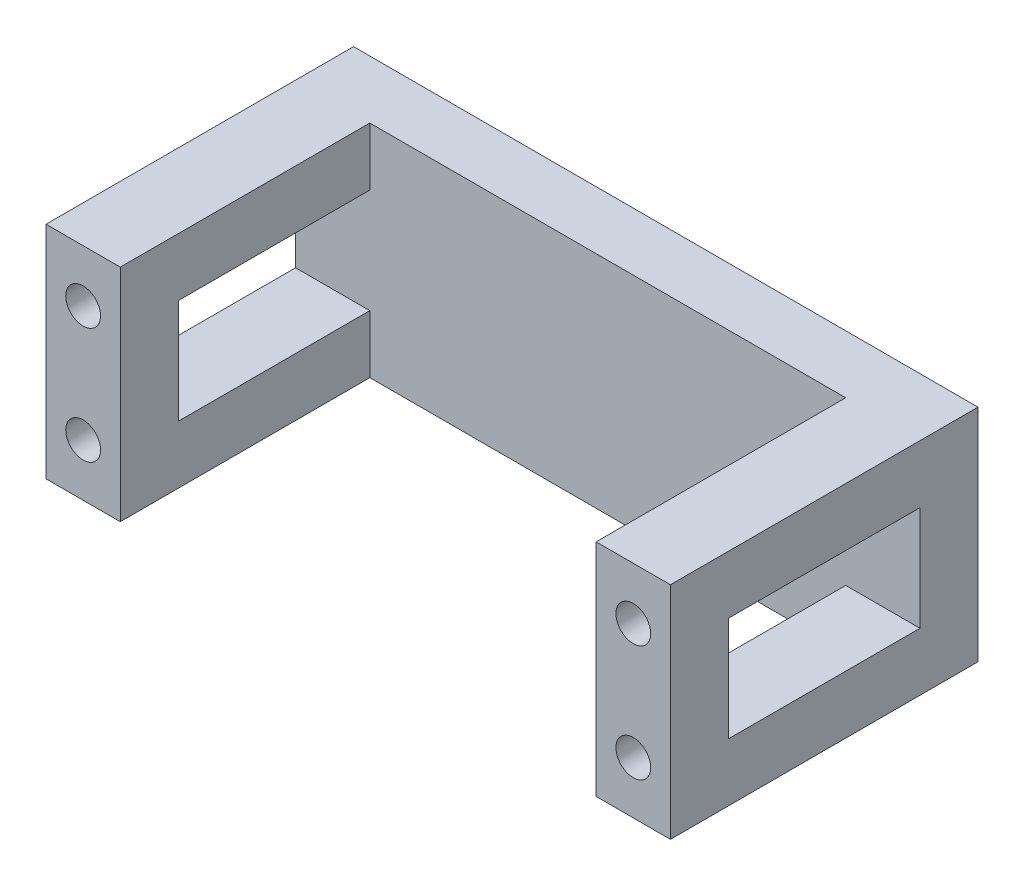
ISO-10303-21;
HEADER;
FILE_DESCRIPTION(('STEP AP214'),'2;1');
FILE_NAME('part.step','',(''),(''),'','','');
FILE_SCHEMA(('AUTOMOTIVE_DESIGN { 1 0 10303 214 1 1 1 1 }'));
ENDSEC;
DATA;
#1=APPLICATION_CONTEXT('core data for automotive mechanical design processes');
#2=APPLICATION_PROTOCOL_DEFINITION('international standard','automotive_design',2000,#1);
#3=PRODUCT_CONTEXT('',#1,'mechanical');
#4=PRODUCT('Part','Part','',(#3));
#5=PRODUCT_RELATED_PRODUCT_CATEGORY('part','',(#4));
#6=PRODUCT_DEFINITION_FORMATION('','',#4);
#7=PRODUCT_DEFINITION_CONTEXT('part definition',#1,'design');
#8=PRODUCT_DEFINITION('design','',#6,#7);
#9=PRODUCT_DEFINITION_SHAPE('','',#8);
#10=(LENGTH_UNIT() NAMED_UNIT(*) SI_UNIT(.MILLI.,.METRE.));
#11=(NAMED_UNIT(*) PLANE_ANGLE_UNIT() SI_UNIT($,.RADIAN.));
#12=(NAMED_UNIT(*) SI_UNIT($,.STERADIAN.) SOLID_ANGLE_UNIT());
#13=UNCERTAINTY_MEASURE_WITH_UNIT(LENGTH_MEASURE(1.E-05),#10,'distance_accuracy_value','');
#14=(GEOMETRIC_REPRESENTATION_CONTEXT(3) GLOBAL_UNCERTAINTY_ASSIGNED_CONTEXT((#13)) GLOBAL_UNIT_ASSIGNED_CONTEXT((#10,
#11,#12)) REPRESENTATION_CONTEXT('',''));
#15=CARTESIAN_POINT('',(0.,0.,0.));
#16=DIRECTION('',(0.,0.,1.));
#17=DIRECTION('',(1.,0.,0.));
#18=AXIS2_PLACEMENT_3D('',#15,#16,#17);
#19=CARTESIAN_POINT('',(3.2,-9.5,-4.));
#20=DIRECTION('',(0.,0.,1.));
#21=DIRECTION('',(1.,0.,0.));
#22=AXIS2_PLACEMENT_3D('',#19,#20,#21);
#23=PLANE('',#22);
#24=CARTESIAN_POINT('',(3.2,-4.5,-4.));
#25=DIRECTION('',(0.,0.,-1.));
#26=DIRECTION('',(-1.,0.,0.));
#27=AXIS2_PLACEMENT_3D('',#24,#25,#26);
#28=CIRCLE('',#27,1.5);
#29=CARTESIAN_POINT('',(1.7,-4.5,-4.));
#30=VERTEX_POINT('',#29);
#31=EDGE_CURVE('E19',#30,#30,#28,.F.);
#32=ORIENTED_EDGE('',*,*,#31,.T.);
#33=EDGE_LOOP('',(#32));
#34=FACE_BOUND('',#33,.T.);
#35=ADVANCED_FACE('F16',(#34),#23,.T.);
#36=CARTESIAN_POINT('',(3.2,-9.5,-4.));
#37=DIRECTION('',(0.,0.,1.));
#38=DIRECTION('',(1.,0.,0.));
#39=AXIS2_PLACEMENT_3D('',#36,#37,#38);
#40=PLANE('',#39);
#41=CARTESIAN_POINT('',(3.2,-14.5,-4.));
#42=DIRECTION('',(0.,0.,-1.));
#43=DIRECTION('',(-1.,0.,0.));
#44=AXIS2_PLACEMENT_3D('',#41,#42,#43);
#45=CIRCLE('',#44,1.5);
#46=CARTESIAN_POINT('',(1.7,-14.5,-4.));
#47=VERTEX_POINT('',#46);
#48=EDGE_CURVE('E182',#47,#47,#45,.F.);
#49=ORIENTED_EDGE('',*,*,#48,.T.);
#50=EDGE_LOOP('',(#49));
#51=FACE_BOUND('',#50,.T.);
#52=ADVANCED_FACE('F280',(#51),#40,.T.);
#53=CARTESIAN_POINT('',(50.6,-9.5,-4.));
#54=DIRECTION('',(0.,0.,1.));
#55=DIRECTION('',(1.,0.,0.));
#56=AXIS2_PLACEMENT_3D('',#53,#54,#55);
#57=PLANE('',#56);
#58=CARTESIAN_POINT('',(50.6,-14.5,-4.));
#59=DIRECTION('',(0.,0.,-1.));
#60=DIRECTION('',(-1.,0.,0.));
#61=AXIS2_PLACEMENT_3D('',#58,#59,#60);
#62=CIRCLE('',#61,1.5);
#63=CARTESIAN_POINT('',(49.1,-14.5,-4.));
#64=VERTEX_POINT('',#63);
#65=EDGE_CURVE('E180',#64,#64,#62,.F.);
#66=ORIENTED_EDGE('',*,*,#65,.T.);
#67=EDGE_LOOP('',(#66));
#68=FACE_BOUND('',#67,.T.);
#69=ADVANCED_FACE('F204',(#68),#57,.T.);
#70=CARTESIAN_POINT('',(50.6,-9.5,-4.));
#71=DIRECTION('',(0.,0.,1.));
#72=DIRECTION('',(1.,0.,0.));
#73=AXIS2_PLACEMENT_3D('',#70,#71,#72);
#74=PLANE('',#73);
#75=CARTESIAN_POINT('',(50.6,-4.5,-4.));
#76=DIRECTION('',(0.,0.,-1.));
#77=DIRECTION('',(-1.,0.,0.));
#78=AXIS2_PLACEMENT_3D('',#75,#76,#77);
#79=CIRCLE('',#78,1.5);
#80=CARTESIAN_POINT('',(49.1,-4.5,-4.));
#81=VERTEX_POINT('',#80);
#82=EDGE_CURVE('E167',#81,#81,#79,.F.);
#83=ORIENTED_EDGE('',*,*,#82,.T.);
#84=EDGE_LOOP('',(#83));
#85=FACE_BOUND('',#84,.T.);
#86=ADVANCED_FACE('F193',(#85),#74,.T.);
#87=CARTESIAN_POINT('',(3.2,-4.5,-4.));
#88=DIRECTION('',(0.,0.,-1.));
#89=DIRECTION('',(-1.,0.,0.));
#90=AXIS2_PLACEMENT_3D('',#87,#88,#89);
#91=CYLINDRICAL_SURFACE('',#90,1.5);
#92=CARTESIAN_POINT('',(3.2,-4.5,0.));
#93=DIRECTION('',(0.,0.,-1.));
#94=DIRECTION('',(-1.,0.,0.));
#95=AXIS2_PLACEMENT_3D('',#92,#93,#94);
#96=CIRCLE('',#95,1.5);
#97=CARTESIAN_POINT('',(1.7,-4.5,0.));
#98=VERTEX_POINT('',#97);
#99=EDGE_CURVE('E162',#98,#98,#96,.F.);
#100=ORIENTED_EDGE('',*,*,#99,.T.);
#101=EDGE_LOOP('',(#100));
#102=FACE_BOUND('',#101,.T.);
#103=ORIENTED_EDGE('',*,*,#31,.F.);
#104=EDGE_LOOP('',(#103));
#105=FACE_BOUND('',#104,.T.);
#106=ADVANCED_FACE('F190',(#102,#105),#91,.F.);
#107=CARTESIAN_POINT('',(3.2,-14.5,-4.));
#108=DIRECTION('',(0.,0.,-1.));
#109=DIRECTION('',(-1.,0.,0.));
#110=AXIS2_PLACEMENT_3D('',#107,#108,#109);
#111=CYLINDRICAL_SURFACE('',#110,1.5);
#112=CARTESIAN_POINT('',(3.2,-14.5,0.));
#113=DIRECTION('',(0.,0.,-1.));
#114=DIRECTION('',(-1.,0.,0.));
#115=AXIS2_PLACEMENT_3D('',#112,#113,#114);
#116=CIRCLE('',#115,1.5);
#117=CARTESIAN_POINT('',(1.7,-14.5,0.));
#118=VERTEX_POINT('',#117);
#119=EDGE_CURVE('E173',#118,#118,#116,.F.);
#120=ORIENTED_EDGE('',*,*,#119,.T.);
#121=EDGE_LOOP('',(#120));
#122=FACE_BOUND('',#121,.T.);
#123=ORIENTED_EDGE('',*,*,#48,.F.);
#124=EDGE_LOOP('',(#123));
#125=FACE_BOUND('',#124,.T.);
#126=ADVANCED_FACE('F192',(#122,#125),#111,.F.);
#127=CARTESIAN_POINT('',(50.6,-14.5,-4.));
#128=DIRECTION('',(0.,0.,-1.));
#129=DIRECTION('',(-1.,0.,0.));
#130=AXIS2_PLACEMENT_3D('',#127,#128,#129);
#131=CYLINDRICAL_SURFACE('',#130,1.5);
#132=CARTESIAN_POINT('',(50.6,-14.5,0.));
#133=DIRECTION('',(0.,0.,-1.));
#134=DIRECTION('',(-1.,0.,0.));
#135=AXIS2_PLACEMENT_3D('',#132,#133,#134);
#136=CIRCLE('',#135,1.5);
#137=CARTESIAN_POINT('',(49.1,-14.5,0.));
#138=VERTEX_POINT('',#137);
#139=EDGE_CURVE('E170',#138,#138,#136,.F.);
#140=ORIENTED_EDGE('',*,*,#139,.T.);
#141=EDGE_LOOP('',(#140));
#142=FACE_BOUND('',#141,.T.);
#143=ORIENTED_EDGE('',*,*,#65,.F.);
#144=EDGE_LOOP('',(#143));
#145=FACE_BOUND('',#144,.T.);
#146=ADVANCED_FACE('F201',(#142,#145),#131,.F.);
#147=CARTESIAN_POINT('',(50.6,-4.5,-4.));
#148=DIRECTION('',(0.,0.,-1.));
#149=DIRECTION('',(-1.,0.,0.));
#150=AXIS2_PLACEMENT_3D('',#147,#148,#149);
#151=CYLINDRICAL_SURFACE('',#150,1.5);
#152=CARTESIAN_POINT('',(50.6,-4.5,0.));
#153=DIRECTION('',(0.,0.,-1.));
#154=DIRECTION('',(-1.,0.,0.));
#155=AXIS2_PLACEMENT_3D('',#152,#153,#154);
#156=CIRCLE('',#155,1.5);
#157=CARTESIAN_POINT('',(49.1,-4.5,0.));
#158=VERTEX_POINT('',#157);
#159=EDGE_CURVE('E158',#158,#158,#156,.F.);
#160=ORIENTED_EDGE('',*,*,#159,.T.);
#161=EDGE_LOOP('',(#160));
#162=FACE_BOUND('',#161,.T.);
#163=ORIENTED_EDGE('',*,*,#82,.F.);
#164=EDGE_LOOP('',(#163));
#165=FACE_BOUND('',#164,.T.);
#166=ADVANCED_FACE('F266',(#162,#165),#151,.F.);
#167=CARTESIAN_POINT('',(62.9201740579376,-5.,-13.25));
#168=DIRECTION('',(0.,1.,0.));
#169=DIRECTION('',(0.,0.,1.));
#170=AXIS2_PLACEMENT_3D('',#167,#168,#169);
#171=PLANE('',#170);
#172=DIRECTION('',(0.,0.,-1.));
#173=VECTOR('',#172,1.);
#174=CARTESIAN_POINT('',(0.,-5.,-13.25));
#175=LINE('',#174,#173);
#176=CARTESIAN_POINT('',(0.,-5.,-5.));
#177=VERTEX_POINT('',#176);
#178=CARTESIAN_POINT('',(0.,-5.,-21.5));
#179=VERTEX_POINT('',#178);
#180=EDGE_CURVE('E436',#177,#179,#175,.T.);
#181=ORIENTED_EDGE('',*,*,#180,.T.);
#182=DIRECTION('',(1.,0.,0.));
#183=VECTOR('',#182,1.);
#184=CARTESIAN_POINT('',(26.9,-5.,-21.5));
#185=LINE('',#184,#183);
#186=CARTESIAN_POINT('',(6.4,-5.,-21.5));
#187=VERTEX_POINT('',#186);
#188=EDGE_CURVE('E438',#187,#179,#185,.F.);
#189=ORIENTED_EDGE('',*,*,#188,.F.);
#190=DIRECTION('',(0.,0.,1.));
#191=VECTOR('',#190,1.);
#192=CARTESIAN_POINT('',(6.4,-5.,-10.75));
#193=LINE('',#192,#191);
#194=CARTESIAN_POINT('',(6.4,-5.,-5.));
#195=VERTEX_POINT('',#194);
#196=EDGE_CURVE('E456',#187,#195,#193,.T.);
#197=ORIENTED_EDGE('',*,*,#196,.T.);
#198=DIRECTION('',(1.,0.,0.));
#199=VECTOR('',#198,1.);
#200=CARTESIAN_POINT('',(62.9201740579376,-5.,-5.));
#201=LINE('',#200,#199);
#202=EDGE_CURVE('E142',#177,#195,#201,.T.);
#203=ORIENTED_EDGE('',*,*,#202,.F.);
#204=EDGE_LOOP('',(#181,#189,#197,#203));
#205=FACE_BOUND('',#204,.T.);
#206=ADVANCED_FACE('F262',(#205),#171,.F.);
#207=CARTESIAN_POINT('',(62.9201740579376,-14.,-13.25));
#208=DIRECTION('',(0.,1.,0.));
#209=DIRECTION('',(0.,0.,1.));
#210=AXIS2_PLACEMENT_3D('',#207,#208,#209);
#211=PLANE('',#210);
#212=DIRECTION('',(0.,0.,-1.));
#213=VECTOR('',#212,1.);
#214=CARTESIAN_POINT('',(0.,-14.,-13.25));
#215=LINE('',#214,#213);
#216=CARTESIAN_POINT('',(0.,-14.,-21.5));
#217=VERTEX_POINT('',#216);
#218=CARTESIAN_POINT('',(0.,-14.,-5.));
#219=VERTEX_POINT('',#218);
#220=EDGE_CURVE('E447',#217,#219,#215,.F.);
#221=ORIENTED_EDGE('',*,*,#220,.T.);
#222=DIRECTION('',(1.,0.,0.));
#223=VECTOR('',#222,1.);
#224=CARTESIAN_POINT('',(62.9201740579376,-14.,-5.));
#225=LINE('',#224,#223);
#226=CARTESIAN_POINT('',(6.4,-14.,-5.));
#227=VERTEX_POINT('',#226);
#228=EDGE_CURVE('E165',#227,#219,#225,.F.);
#229=ORIENTED_EDGE('',*,*,#228,.F.);
#230=DIRECTION('',(0.,0.,1.));
#231=VECTOR('',#230,1.);
#232=CARTESIAN_POINT('',(6.4,-14.,-10.75));
#233=LINE('',#232,#231);
#234=CARTESIAN_POINT('',(6.4,-14.,-21.5));
#235=VERTEX_POINT('',#234);
#236=EDGE_CURVE('E466',#227,#235,#233,.F.);
#237=ORIENTED_EDGE('',*,*,#236,.T.);
#238=DIRECTION('',(1.,0.,0.));
#239=VECTOR('',#238,1.);
#240=CARTESIAN_POINT('',(26.9,-14.,-21.5));
#241=LINE('',#240,#239);
#242=EDGE_CURVE('E476',#217,#235,#241,.T.);
#243=ORIENTED_EDGE('',*,*,#242,.F.);
#244=EDGE_LOOP('',(#221,#229,#237,#243));
#245=FACE_BOUND('',#244,.T.);
#246=ADVANCED_FACE('F258',(#245),#211,.T.);
#247=CARTESIAN_POINT('',(62.9201740579376,-9.5,-5.));
#248=DIRECTION('',(0.,0.,-1.));
#249=DIRECTION('',(0.,1.,0.));
#250=AXIS2_PLACEMENT_3D('',#247,#248,#249);
#251=PLANE('',#250);
#252=DIRECTION('',(0.,1.,0.));
#253=VECTOR('',#252,1.);
#254=CARTESIAN_POINT('',(0.,-19.,-5.));
#255=LINE('',#254,#253);
#256=EDGE_CURVE('E531',#219,#177,#255,.T.);
#257=ORIENTED_EDGE('',*,*,#256,.T.);
#258=ORIENTED_EDGE('',*,*,#202,.T.);
#259=DIRECTION('',(0.,1.,0.));
#260=VECTOR('',#259,1.);
#261=CARTESIAN_POINT('',(6.4,-19.,-5.));
#262=LINE('',#261,#260);
#263=EDGE_CURVE('E450',#195,#227,#262,.F.);
#264=ORIENTED_EDGE('',*,*,#263,.T.);
#265=ORIENTED_EDGE('',*,*,#228,.T.);
#266=EDGE_LOOP('',(#257,#258,#264,#265));
#267=FACE_BOUND('',#266,.T.);
#268=ADVANCED_FACE('F255',(#267),#251,.T.);
#269=CARTESIAN_POINT('',(62.9201740579376,-14.,-13.25));
#270=DIRECTION('',(0.,1.,0.));
#271=DIRECTION('',(0.,0.,1.));
#272=AXIS2_PLACEMENT_3D('',#269,#270,#271);
#273=PLANE('',#272);
#274=DIRECTION('',(0.,0.,-1.));
#275=VECTOR('',#274,1.);
#276=CARTESIAN_POINT('',(47.4,-14.,-10.75));
#277=LINE('',#276,#275);
#278=CARTESIAN_POINT('',(47.4,-14.,-21.5));
#279=VERTEX_POINT('',#278);
#280=CARTESIAN_POINT('',(47.4,-14.,-5.));
#281=VERTEX_POINT('',#280);
#282=EDGE_CURVE('E147',#279,#281,#277,.F.);
#283=ORIENTED_EDGE('',*,*,#282,.T.);
#284=DIRECTION('',(1.,0.,0.));
#285=VECTOR('',#284,1.);
#286=CARTESIAN_POINT('',(62.9201740579376,-14.,-5.));
#287=LINE('',#286,#285);
#288=CARTESIAN_POINT('',(53.8,-14.,-5.));
#289=VERTEX_POINT('',#288);
#290=EDGE_CURVE('E133',#289,#281,#287,.F.);
#291=ORIENTED_EDGE('',*,*,#290,.F.);
#292=DIRECTION('',(0.,0.,1.));
#293=VECTOR('',#292,1.);
#294=CARTESIAN_POINT('',(53.8,-14.,-13.25));
#295=LINE('',#294,#293);
#296=CARTESIAN_POINT('',(53.8,-14.,-21.5));
#297=VERTEX_POINT('',#296);
#298=EDGE_CURVE('E510',#289,#297,#295,.F.);
#299=ORIENTED_EDGE('',*,*,#298,.T.);
#300=DIRECTION('',(1.,0.,0.));
#301=VECTOR('',#300,1.);
#302=CARTESIAN_POINT('',(26.9,-14.,-21.5));
#303=LINE('',#302,#301);
#304=EDGE_CURVE('E154',#279,#297,#303,.T.);
#305=ORIENTED_EDGE('',*,*,#304,.F.);
#306=EDGE_LOOP('',(#283,#291,#299,#305));
#307=FACE_BOUND('',#306,.T.);
#308=ADVANCED_FACE('F153',(#307),#273,.T.);
#309=CARTESIAN_POINT('',(62.9201740579376,-5.,-13.25));
#310=DIRECTION('',(0.,1.,0.));
#311=DIRECTION('',(0.,0.,1.));
#312=AXIS2_PLACEMENT_3D('',#309,#310,#311);
#313=PLANE('',#312);
#314=DIRECTION('',(0.,0.,-1.));
#315=VECTOR('',#314,1.);
#316=CARTESIAN_POINT('',(47.4,-5.,-10.75));
#317=LINE('',#316,#315);
#318=CARTESIAN_POINT('',(47.4,-5.,-5.));
#319=VERTEX_POINT('',#318);
#320=CARTESIAN_POINT('',(47.4,-5.,-21.5));
#321=VERTEX_POINT('',#320);
#322=EDGE_CURVE('E150',#319,#321,#317,.T.);
#323=ORIENTED_EDGE('',*,*,#322,.T.);
#324=DIRECTION('',(1.,0.,0.));
#325=VECTOR('',#324,1.);
#326=CARTESIAN_POINT('',(26.9,-5.,-21.5));
#327=LINE('',#326,#325);
#328=CARTESIAN_POINT('',(53.8,-5.,-21.5));
#329=VERTEX_POINT('',#328);
#330=EDGE_CURVE('E471',#329,#321,#327,.F.);
#331=ORIENTED_EDGE('',*,*,#330,.F.);
#332=DIRECTION('',(0.,0.,1.));
#333=VECTOR('',#332,1.);
#334=CARTESIAN_POINT('',(53.8,-5.,-13.25));
#335=LINE('',#334,#333);
#336=CARTESIAN_POINT('',(53.8,-5.,-5.));
#337=VERTEX_POINT('',#336);
#338=EDGE_CURVE('E506',#329,#337,#335,.T.);
#339=ORIENTED_EDGE('',*,*,#338,.T.);
#340=DIRECTION('',(1.,0.,0.));
#341=VECTOR('',#340,1.);
#342=CARTESIAN_POINT('',(62.9201740579376,-5.,-5.));
#343=LINE('',#342,#341);
#344=EDGE_CURVE('E126',#319,#337,#343,.T.);
#345=ORIENTED_EDGE('',*,*,#344,.F.);
#346=EDGE_LOOP('',(#323,#331,#339,#345));
#347=FACE_BOUND('',#346,.T.);
#348=ADVANCED_FACE('F250',(#347),#313,.F.);
#349=CARTESIAN_POINT('',(62.9201740579376,-9.5,-5.));
#350=DIRECTION('',(0.,0.,-1.));
#351=DIRECTION('',(0.,1.,0.));
#352=AXIS2_PLACEMENT_3D('',#349,#350,#351);
#353=PLANE('',#352);
#354=DIRECTION('',(0.,1.,0.));
#355=VECTOR('',#354,1.);
#356=CARTESIAN_POINT('',(47.4,-19.,-5.));
#357=LINE('',#356,#355);
#358=EDGE_CURVE('E136',#281,#319,#357,.T.);
#359=ORIENTED_EDGE('',*,*,#358,.T.);
#360=ORIENTED_EDGE('',*,*,#344,.T.);
#361=DIRECTION('',(0.,1.,0.));
#362=VECTOR('',#361,1.);
#363=CARTESIAN_POINT('',(53.8,-19.,-5.));
#364=LINE('',#363,#362);
#365=EDGE_CURVE('E138',#337,#289,#364,.F.);
#366=ORIENTED_EDGE('',*,*,#365,.T.);
#367=ORIENTED_EDGE('',*,*,#290,.T.);
#368=EDGE_LOOP('',(#359,#360,#366,#367));
#369=FACE_BOUND('',#368,.T.);
#370=ADVANCED_FACE('F135',(#369),#353,.T.);
#371=CARTESIAN_POINT('',(3.2,-19.,0.));
#372=DIRECTION('',(0.,0.,-1.));
#373=DIRECTION('',(-1.,0.,0.));
#374=AXIS2_PLACEMENT_3D('',#371,#372,#373);
#375=PLANE('',#374);
#376=DIRECTION('',(0.,1.,0.));
#377=VECTOR('',#376,1.);
#378=CARTESIAN_POINT('',(0.,-19.,0.));
#379=LINE('',#378,#377);
#380=CARTESIAN_POINT('',(0.,0.,0.));
#381=VERTEX_POINT('',#380);
#382=CARTESIAN_POINT('',(0.,-19.,0.));
#383=VERTEX_POINT('',#382);
#384=EDGE_CURVE('E444',#381,#383,#379,.F.);
#385=ORIENTED_EDGE('',*,*,#384,.T.);
#386=DIRECTION('',(1.,0.,0.));
#387=VECTOR('',#386,1.);
#388=CARTESIAN_POINT('',(26.9,-19.,0.));
#389=LINE('',#388,#387);
#390=CARTESIAN_POINT('',(6.4,-19.,0.));
#391=VERTEX_POINT('',#390);
#392=EDGE_CURVE('E526',#391,#383,#389,.F.);
#393=ORIENTED_EDGE('',*,*,#392,.F.);
#394=DIRECTION('',(0.,1.,0.));
#395=VECTOR('',#394,1.);
#396=CARTESIAN_POINT('',(6.4,-19.,0.));
#397=LINE('',#396,#395);
#398=CARTESIAN_POINT('',(6.4,0.,0.));
#399=VERTEX_POINT('',#398);
#400=EDGE_CURVE('E461',#391,#399,#397,.T.);
#401=ORIENTED_EDGE('',*,*,#400,.T.);
#402=DIRECTION('',(1.,0.,0.));
#403=VECTOR('',#402,1.);
#404=CARTESIAN_POINT('',(26.9,0.,0.));
#405=LINE('',#404,#403);
#406=EDGE_CURVE('E502',#399,#381,#405,.F.);
#407=ORIENTED_EDGE('',*,*,#406,.T.);
#408=EDGE_LOOP('',(#385,#393,#401,#407));
#409=FACE_BOUND('',#408,.T.);
#410=ORIENTED_EDGE('',*,*,#119,.F.);
#411=EDGE_LOOP('',(#410));
#412=FACE_BOUND('',#411,.T.);
#413=ORIENTED_EDGE('',*,*,#99,.F.);
#414=EDGE_LOOP('',(#413));
#415=FACE_BOUND('',#414,.T.);
#416=ADVANCED_FACE('F243',(#409,#412,#415),#375,.F.);
#417=CARTESIAN_POINT('',(50.6,-19.,0.));
#418=DIRECTION('',(0.,0.,-1.));
#419=DIRECTION('',(-1.,0.,0.));
#420=AXIS2_PLACEMENT_3D('',#417,#418,#419);
#421=PLANE('',#420);
#422=DIRECTION('',(0.,1.,0.));
#423=VECTOR('',#422,1.);
#424=CARTESIAN_POINT('',(47.4,-19.,0.));
#425=LINE('',#424,#423);
#426=CARTESIAN_POINT('',(47.4,0.,0.));
#427=VERTEX_POINT('',#426);
#428=CARTESIAN_POINT('',(47.4,-19.,0.));
#429=VERTEX_POINT('',#428);
#430=EDGE_CURVE('E155',#427,#429,#425,.F.);
#431=ORIENTED_EDGE('',*,*,#430,.T.);
#432=DIRECTION('',(1.,0.,0.));
#433=VECTOR('',#432,1.);
#434=CARTESIAN_POINT('',(26.9,-19.,0.));
#435=LINE('',#434,#433);
#436=CARTESIAN_POINT('',(53.8,-19.,0.));
#437=VERTEX_POINT('',#436);
#438=EDGE_CURVE('E522',#437,#429,#435,.F.);
#439=ORIENTED_EDGE('',*,*,#438,.F.);
#440=DIRECTION('',(0.,1.,0.));
#441=VECTOR('',#440,1.);
#442=CARTESIAN_POINT('',(53.8,-19.,0.));
#443=LINE('',#442,#441);
#444=CARTESIAN_POINT('',(53.8,0.,0.));
#445=VERTEX_POINT('',#444);
#446=EDGE_CURVE('E512',#437,#445,#443,.T.);
#447=ORIENTED_EDGE('',*,*,#446,.T.);
#448=DIRECTION('',(1.,0.,0.));
#449=VECTOR('',#448,1.);
#450=CARTESIAN_POINT('',(26.9,0.,0.));
#451=LINE('',#450,#449);
#452=EDGE_CURVE('E493',#445,#427,#451,.F.);
#453=ORIENTED_EDGE('',*,*,#452,.T.);
#454=EDGE_LOOP('',(#431,#439,#447,#453));
#455=FACE_BOUND('',#454,.T.);
#456=ORIENTED_EDGE('',*,*,#159,.F.);
#457=EDGE_LOOP('',(#456));
#458=FACE_BOUND('',#457,.T.);
#459=ORIENTED_EDGE('',*,*,#139,.F.);
#460=EDGE_LOOP('',(#459));
#461=FACE_BOUND('',#460,.T.);
#462=ADVANCED_FACE('F240',(#455,#458,#461),#421,.F.);
#463=CARTESIAN_POINT('',(47.4,-19.,-10.75));
#464=DIRECTION('',(1.,0.,0.));
#465=DIRECTION('',(0.,0.,-1.));
#466=AXIS2_PLACEMENT_3D('',#463,#464,#465);
#467=PLANE('',#466);
#468=ORIENTED_EDGE('',*,*,#322,.F.);
#469=ORIENTED_EDGE('',*,*,#358,.F.);
#470=ORIENTED_EDGE('',*,*,#282,.F.);
#471=DIRECTION('',(0.,1.,0.));
#472=VECTOR('',#471,1.);
#473=CARTESIAN_POINT('',(47.4,-19.,-21.5));
#474=LINE('',#473,#472);
#475=CARTESIAN_POINT('',(47.4,-19.,-21.5));
#476=VERTEX_POINT('',#475);
#477=EDGE_CURVE('E474',#476,#279,#474,.T.);
#478=ORIENTED_EDGE('',*,*,#477,.F.);
#479=DIRECTION('',(0.,0.,-1.));
#480=VECTOR('',#479,1.);
#481=CARTESIAN_POINT('',(47.4,-19.,-13.5));
#482=LINE('',#481,#480);
#483=EDGE_CURVE('E520',#429,#476,#482,.T.);
#484=ORIENTED_EDGE('',*,*,#483,.F.);
#485=ORIENTED_EDGE('',*,*,#430,.F.);
#486=DIRECTION('',(0.,0.,-1.));
#487=VECTOR('',#486,1.);
#488=CARTESIAN_POINT('',(47.4,0.,-13.5));
#489=LINE('',#488,#487);
#490=CARTESIAN_POINT('',(47.4,0.,-21.5));
#491=VERTEX_POINT('',#490);
#492=EDGE_CURVE('E481',#427,#491,#489,.T.);
#493=ORIENTED_EDGE('',*,*,#492,.T.);
#494=DIRECTION('',(0.,1.,0.));
#495=VECTOR('',#494,1.);
#496=CARTESIAN_POINT('',(47.4,-19.,-21.5));
#497=LINE('',#496,#495);
#498=EDGE_CURVE('E469',#321,#491,#497,.T.);
#499=ORIENTED_EDGE('',*,*,#498,.F.);
#500=EDGE_LOOP('',(#468,#469,#470,#478,#484,#485,#493,#499));
#501=FACE_BOUND('',#500,.T.);
#502=ADVANCED_FACE('F145',(#501),#467,.F.);
#503=CARTESIAN_POINT('',(26.9,-19.,-21.5));
#504=DIRECTION('',(0.,0.,1.));
#505=DIRECTION('',(1.,0.,0.));
#506=AXIS2_PLACEMENT_3D('',#503,#504,#505);
#507=PLANE('',#506);
#508=ORIENTED_EDGE('',*,*,#498,.T.);
#509=DIRECTION('',(1.,0.,0.));
#510=VECTOR('',#509,1.);
#511=CARTESIAN_POINT('',(26.9,0.,-21.5));
#512=LINE('',#511,#510);
#513=CARTESIAN_POINT('',(6.4,0.,-21.5));
#514=VERTEX_POINT('',#513);
#515=EDGE_CURVE('E484',#491,#514,#512,.F.);
#516=ORIENTED_EDGE('',*,*,#515,.T.);
#517=DIRECTION('',(0.,1.,0.));
#518=VECTOR('',#517,1.);
#519=CARTESIAN_POINT('',(6.4,-19.,-21.5));
#520=LINE('',#519,#518);
#521=EDGE_CURVE('E458',#514,#187,#520,.F.);
#522=ORIENTED_EDGE('',*,*,#521,.T.);
#523=ORIENTED_EDGE('',*,*,#188,.T.);
#524=DIRECTION('',(0.,1.,0.));
#525=VECTOR('',#524,1.);
#526=CARTESIAN_POINT('',(0.,-19.,-21.5));
#527=LINE('',#526,#525);
#528=EDGE_CURVE('E443',#179,#217,#527,.F.);
#529=ORIENTED_EDGE('',*,*,#528,.T.);
#530=ORIENTED_EDGE('',*,*,#242,.T.);
#531=DIRECTION('',(0.,1.,0.));
#532=VECTOR('',#531,1.);
#533=CARTESIAN_POINT('',(6.4,-19.,-21.5));
#534=LINE('',#533,#532);
#535=CARTESIAN_POINT('',(6.4,-19.,-21.5));
#536=VERTEX_POINT('',#535);
#537=EDGE_CURVE('E464',#235,#536,#534,.F.);
#538=ORIENTED_EDGE('',*,*,#537,.T.);
#539=DIRECTION('',(1.,0.,0.));
#540=VECTOR('',#539,1.);
#541=CARTESIAN_POINT('',(26.9,-19.,-21.5));
#542=LINE('',#541,#540);
#543=EDGE_CURVE('E517',#476,#536,#542,.F.);
#544=ORIENTED_EDGE('',*,*,#543,.F.);
#545=ORIENTED_EDGE('',*,*,#477,.T.);
#546=ORIENTED_EDGE('',*,*,#304,.T.);
#547=DIRECTION('',(0.,1.,0.));
#548=VECTOR('',#547,1.);
#549=CARTESIAN_POINT('',(53.8,-19.,-21.5));
#550=LINE('',#549,#548);
#551=EDGE_CURVE('E508',#297,#329,#550,.T.);
#552=ORIENTED_EDGE('',*,*,#551,.T.);
#553=ORIENTED_EDGE('',*,*,#330,.T.);
#554=EDGE_LOOP('',(#508,#516,#522,#523,#529,#530,#538,#544,#545,#546,#552,#553));
#555=FACE_BOUND('',#554,.T.);
#556=ADVANCED_FACE('F233',(#555),#507,.T.);
#557=CARTESIAN_POINT('',(6.4,-19.,-10.75));
#558=DIRECTION('',(-1.,0.,0.));
#559=DIRECTION('',(0.,0.,1.));
#560=AXIS2_PLACEMENT_3D('',#557,#558,#559);
#561=PLANE('',#560);
#562=ORIENTED_EDGE('',*,*,#196,.F.);
#563=ORIENTED_EDGE('',*,*,#521,.F.);
#564=DIRECTION('',(0.,0.,-1.));
#565=VECTOR('',#564,1.);
#566=CARTESIAN_POINT('',(6.4,0.,-13.5));
#567=LINE('',#566,#565);
#568=EDGE_CURVE('E489',#514,#399,#567,.F.);
#569=ORIENTED_EDGE('',*,*,#568,.T.);
#570=ORIENTED_EDGE('',*,*,#400,.F.);
#571=DIRECTION('',(0.,0.,-1.));
#572=VECTOR('',#571,1.);
#573=CARTESIAN_POINT('',(6.4,-19.,-13.5));
#574=LINE('',#573,#572);
#575=EDGE_CURVE('E528',#536,#391,#574,.F.);
#576=ORIENTED_EDGE('',*,*,#575,.F.);
#577=ORIENTED_EDGE('',*,*,#537,.F.);
#578=ORIENTED_EDGE('',*,*,#236,.F.);
#579=ORIENTED_EDGE('',*,*,#263,.F.);
#580=EDGE_LOOP('',(#562,#563,#569,#570,#576,#577,#578,#579));
#581=FACE_BOUND('',#580,.T.);
#582=ADVANCED_FACE('F229',(#581),#561,.F.);
#583=CARTESIAN_POINT('',(0.,-19.,-13.25));
#584=DIRECTION('',(1.,0.,0.));
#585=DIRECTION('',(0.,0.,-1.));
#586=AXIS2_PLACEMENT_3D('',#583,#584,#585);
#587=PLANE('',#586);
#588=ORIENTED_EDGE('',*,*,#220,.F.);
#589=ORIENTED_EDGE('',*,*,#528,.F.);
#590=ORIENTED_EDGE('',*,*,#180,.F.);
#591=ORIENTED_EDGE('',*,*,#256,.F.);
#592=EDGE_LOOP('',(#588,#589,#590,#591));
#593=FACE_BOUND('',#592,.T.);
#594=DIRECTION('',(0.,1.,0.));
#595=VECTOR('',#594,1.);
#596=CARTESIAN_POINT('',(0.,-19.,-26.5));
#597=LINE('',#596,#595);
#598=CARTESIAN_POINT('',(0.,0.,-26.5));
#599=VERTEX_POINT('',#598);
#600=CARTESIAN_POINT('',(0.,-19.,-26.5));
#601=VERTEX_POINT('',#600);
#602=EDGE_CURVE('E491',#599,#601,#597,.F.);
#603=ORIENTED_EDGE('',*,*,#602,.T.);
#604=DIRECTION('',(0.,0.,-1.));
#605=VECTOR('',#604,1.);
#606=CARTESIAN_POINT('',(0.,-19.,-13.5));
#607=LINE('',#606,#605);
#608=EDGE_CURVE('E524',#383,#601,#607,.T.);
#609=ORIENTED_EDGE('',*,*,#608,.F.);
#610=ORIENTED_EDGE('',*,*,#384,.F.);
#611=DIRECTION('',(0.,0.,-1.));
#612=VECTOR('',#611,1.);
#613=CARTESIAN_POINT('',(0.,0.,-13.5));
#614=LINE('',#613,#612);
#615=EDGE_CURVE('E499',#381,#599,#614,.T.);
#616=ORIENTED_EDGE('',*,*,#615,.T.);
#617=EDGE_LOOP('',(#603,#609,#610,#616));
#618=FACE_BOUND('',#617,.T.);
#619=ADVANCED_FACE('F225',(#593,#618),#587,.F.);
#620=CARTESIAN_POINT('',(26.9,-19.,-13.5));
#621=DIRECTION('',(0.,-1.,0.));
#622=DIRECTION('',(0.,0.,-1.));
#623=AXIS2_PLACEMENT_3D('',#620,#621,#622);
#624=PLANE('',#623);
#625=ORIENTED_EDGE('',*,*,#483,.T.);
#626=ORIENTED_EDGE('',*,*,#543,.T.);
#627=ORIENTED_EDGE('',*,*,#575,.T.);
#628=ORIENTED_EDGE('',*,*,#392,.T.);
#629=ORIENTED_EDGE('',*,*,#608,.T.);
#630=DIRECTION('',(1.,0.,0.));
#631=VECTOR('',#630,1.);
#632=CARTESIAN_POINT('',(26.9,-19.,-26.5));
#633=LINE('',#632,#631);
#634=CARTESIAN_POINT('',(53.8,-19.,-26.5));
#635=VERTEX_POINT('',#634);
#636=EDGE_CURVE('E548',#601,#635,#633,.T.);
#637=ORIENTED_EDGE('',*,*,#636,.T.);
#638=DIRECTION('',(0.,0.,1.));
#639=VECTOR('',#638,1.);
#640=CARTESIAN_POINT('',(53.8,-19.,-13.25));
#641=LINE('',#640,#639);
#642=EDGE_CURVE('E514',#635,#437,#641,.T.);
#643=ORIENTED_EDGE('',*,*,#642,.T.);
#644=ORIENTED_EDGE('',*,*,#438,.T.);
#645=EDGE_LOOP('',(#625,#626,#627,#628,#629,#637,#643,#644));
#646=FACE_BOUND('',#645,.T.);
#647=ADVANCED_FACE('F221',(#646),#624,.T.);
#648=CARTESIAN_POINT('',(53.8,-19.,-13.25));
#649=DIRECTION('',(-1.,0.,0.));
#650=DIRECTION('',(0.,0.,1.));
#651=AXIS2_PLACEMENT_3D('',#648,#649,#650);
#652=PLANE('',#651);
#653=ORIENTED_EDGE('',*,*,#338,.F.);
#654=ORIENTED_EDGE('',*,*,#551,.F.);
#655=ORIENTED_EDGE('',*,*,#298,.F.);
#656=ORIENTED_EDGE('',*,*,#365,.F.);
#657=EDGE_LOOP('',(#653,#654,#655,#656));
#658=FACE_BOUND('',#657,.T.);
#659=ORIENTED_EDGE('',*,*,#446,.F.);
#660=ORIENTED_EDGE('',*,*,#642,.F.);
#661=DIRECTION('',(0.,1.,0.));
#662=VECTOR('',#661,1.);
#663=CARTESIAN_POINT('',(53.8,-19.,-26.5));
#664=LINE('',#663,#662);
#665=CARTESIAN_POINT('',(53.8,0.,-26.5));
#666=VERTEX_POINT('',#665);
#667=EDGE_CURVE('E25',#635,#666,#664,.T.);
#668=ORIENTED_EDGE('',*,*,#667,.T.);
#669=DIRECTION('',(0.,0.,-1.));
#670=VECTOR('',#669,1.);
#671=CARTESIAN_POINT('',(53.8,0.,-13.5));
#672=LINE('',#671,#670);
#673=EDGE_CURVE('E33',#666,#445,#672,.F.);
#674=ORIENTED_EDGE('',*,*,#673,.T.);
#675=EDGE_LOOP('',(#659,#660,#668,#674));
#676=FACE_BOUND('',#675,.T.);
#677=ADVANCED_FACE('F215',(#658,#676),#652,.F.);
#678=CARTESIAN_POINT('',(26.9,0.,-13.5));
#679=DIRECTION('',(0.,-1.,0.));
#680=DIRECTION('',(0.,0.,-1.));
#681=AXIS2_PLACEMENT_3D('',#678,#679,#680);
#682=PLANE('',#681);
#683=ORIENTED_EDGE('',*,*,#515,.F.);
#684=ORIENTED_EDGE('',*,*,#492,.F.);
#685=ORIENTED_EDGE('',*,*,#452,.F.);
#686=ORIENTED_EDGE('',*,*,#673,.F.);
#687=DIRECTION('',(1.,0.,0.));
#688=VECTOR('',#687,1.);
#689=CARTESIAN_POINT('',(26.9,0.,-26.5));
#690=LINE('',#689,#688);
#691=EDGE_CURVE('E10',#666,#599,#690,.F.);
#692=ORIENTED_EDGE('',*,*,#691,.T.);
#693=ORIENTED_EDGE('',*,*,#615,.F.);
#694=ORIENTED_EDGE('',*,*,#406,.F.);
#695=ORIENTED_EDGE('',*,*,#568,.F.);
#696=EDGE_LOOP('',(#683,#684,#685,#686,#692,#693,#694,#695));
#697=FACE_BOUND('',#696,.T.);
#698=ADVANCED_FACE('F209',(#697),#682,.F.);
#699=CARTESIAN_POINT('',(26.9,-19.,-26.5));
#700=DIRECTION('',(0.,0.,1.));
#701=DIRECTION('',(1.,0.,0.));
#702=AXIS2_PLACEMENT_3D('',#699,#700,#701);
#703=PLANE('',#702);
#704=ORIENTED_EDGE('',*,*,#667,.F.);
#705=ORIENTED_EDGE('',*,*,#636,.F.);
#706=ORIENTED_EDGE('',*,*,#602,.F.);
#707=ORIENTED_EDGE('',*,*,#691,.F.);
#708=EDGE_LOOP('',(#704,#705,#706,#707));
#709=FACE_BOUND('',#708,.T.);
#710=ADVANCED_FACE('F207',(#709),#703,.F.);
#711=CLOSED_SHELL('',(#35,#52,#69,#86,#106,#126,#146,#166,#206,#246,#268,#308,#348,#370,#416,
#462,#502,#556,#582,#619,#647,#677,#698,#710));
#712=MANIFOLD_SOLID_BREP('B1',#711);
#713=ADVANCED_BREP_SHAPE_REPRESENTATION('',(#18,#712),#14);
#714=SHAPE_DEFINITION_REPRESENTATION(#9,#713);
ENDSEC;
END-ISO-10303-21;
